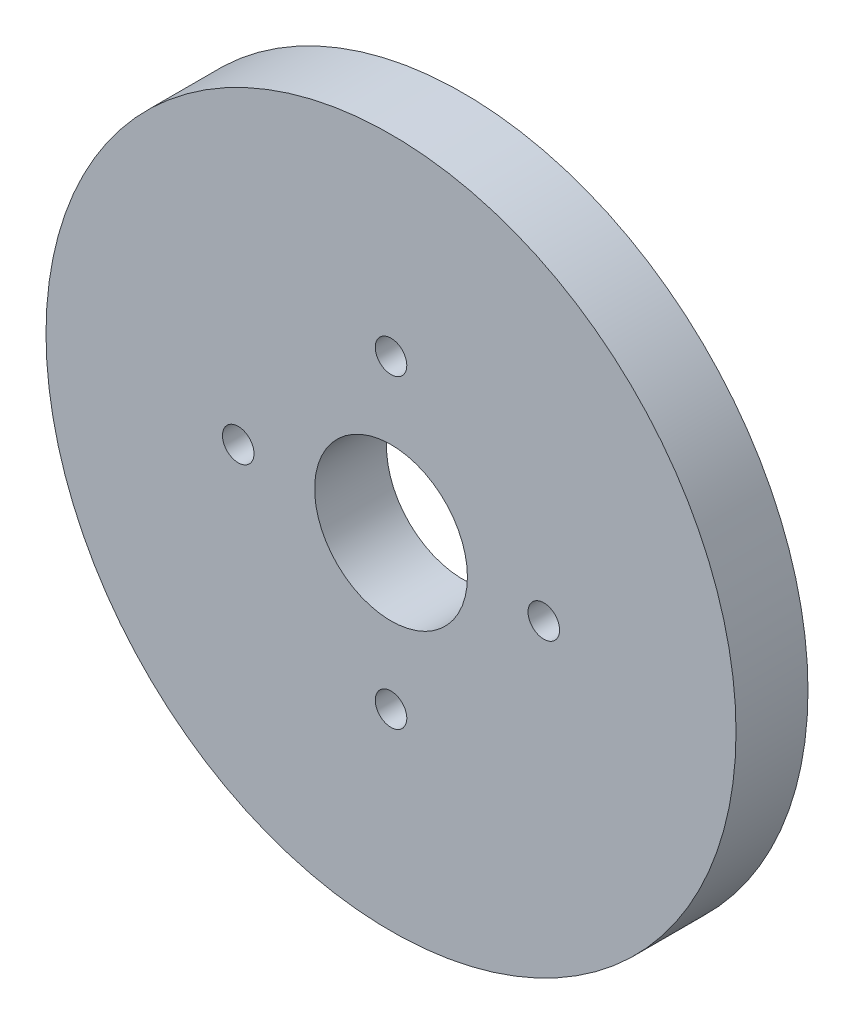
ISO-10303-21;
HEADER;
FILE_DESCRIPTION(('STEP AP214'),'2;1');
FILE_NAME('part.step','',(''),(''),'','','');
FILE_SCHEMA(('AUTOMOTIVE_DESIGN { 1 0 10303 214 1 1 1 1 }'));
ENDSEC;
DATA;
#1=APPLICATION_CONTEXT('core data for automotive mechanical design processes');
#2=APPLICATION_PROTOCOL_DEFINITION('international standard','automotive_design',2000,#1);
#3=PRODUCT_CONTEXT('',#1,'mechanical');
#4=PRODUCT('Part','Part','',(#3));
#5=PRODUCT_RELATED_PRODUCT_CATEGORY('part','',(#4));
#6=PRODUCT_DEFINITION_FORMATION('','',#4);
#7=PRODUCT_DEFINITION_CONTEXT('part definition',#1,'design');
#8=PRODUCT_DEFINITION('design','',#6,#7);
#9=PRODUCT_DEFINITION_SHAPE('','',#8);
#10=(LENGTH_UNIT() NAMED_UNIT(*) SI_UNIT(.MILLI.,.METRE.));
#11=(NAMED_UNIT(*) PLANE_ANGLE_UNIT() SI_UNIT($,.RADIAN.));
#12=(NAMED_UNIT(*) SI_UNIT($,.STERADIAN.) SOLID_ANGLE_UNIT());
#13=UNCERTAINTY_MEASURE_WITH_UNIT(LENGTH_MEASURE(1.E-05),#10,'distance_accuracy_value','');
#14=(GEOMETRIC_REPRESENTATION_CONTEXT(3) GLOBAL_UNCERTAINTY_ASSIGNED_CONTEXT((#13)) GLOBAL_UNIT_ASSIGNED_CONTEXT((#10,
#11,#12)) REPRESENTATION_CONTEXT('',''));
#15=CARTESIAN_POINT('',(0.,0.,0.));
#16=DIRECTION('',(0.,0.,1.));
#17=DIRECTION('',(1.,0.,0.));
#18=AXIS2_PLACEMENT_3D('',#15,#16,#17);
#19=CARTESIAN_POINT('',(0.,0.,1.825));
#20=DIRECTION('',(0.,0.,1.));
#21=DIRECTION('',(1.,0.,0.));
#22=AXIS2_PLACEMENT_3D('',#19,#20,#21);
#23=PLANE('',#22);
#24=CARTESIAN_POINT('',(-7.75,0.,1.825));
#25=DIRECTION('',(0.,0.,1.));
#26=DIRECTION('',(-1.,0.,0.));
#27=AXIS2_PLACEMENT_3D('',#24,#25,#26);
#28=CIRCLE('',#27,0.800000000000001);
#29=CARTESIAN_POINT('',(-8.55,0.,1.825));
#30=VERTEX_POINT('',#29);
#31=EDGE_CURVE('E56',#30,#30,#28,.T.);
#32=ORIENTED_EDGE('',*,*,#31,.F.);
#33=EDGE_LOOP('',(#32));
#34=FACE_BOUND('',#33,.T.);
#35=CARTESIAN_POINT('',(7.75,0.,1.825));
#36=DIRECTION('',(0.,0.,1.));
#37=DIRECTION('',(1.,0.,0.));
#38=AXIS2_PLACEMENT_3D('',#35,#36,#37);
#39=CIRCLE('',#38,0.800000000000001);
#40=CARTESIAN_POINT('',(8.55,0.,1.825));
#41=VERTEX_POINT('',#40);
#42=EDGE_CURVE('E44',#41,#41,#39,.T.);
#43=ORIENTED_EDGE('',*,*,#42,.F.);
#44=EDGE_LOOP('',(#43));
#45=FACE_BOUND('',#44,.T.);
#46=CARTESIAN_POINT('',(0.,0.,1.825));
#47=DIRECTION('',(0.,0.,1.));
#48=DIRECTION('',(1.,0.,0.));
#49=AXIS2_PLACEMENT_3D('',#46,#47,#48);
#50=CIRCLE('',#49,17.5);
#51=CARTESIAN_POINT('',(17.5,0.,1.825));
#52=VERTEX_POINT('',#51);
#53=EDGE_CURVE('E10',#52,#52,#50,.T.);
#54=ORIENTED_EDGE('',*,*,#53,.T.);
#55=EDGE_LOOP('',(#54));
#56=FACE_BOUND('',#55,.T.);
#57=CARTESIAN_POINT('',(0.,0.,1.825));
#58=DIRECTION('',(0.,0.,1.));
#59=DIRECTION('',(1.,0.,0.));
#60=AXIS2_PLACEMENT_3D('',#57,#58,#59);
#61=CIRCLE('',#60,3.875);
#62=CARTESIAN_POINT('',(3.875,0.,1.825));
#63=VERTEX_POINT('',#62);
#64=EDGE_CURVE('E39',#63,#63,#61,.T.);
#65=ORIENTED_EDGE('',*,*,#64,.F.);
#66=EDGE_LOOP('',(#65));
#67=FACE_BOUND('',#66,.T.);
#68=CARTESIAN_POINT('',(0.,7.75,1.825));
#69=DIRECTION('',(0.,0.,1.));
#70=DIRECTION('',(1.,0.,0.));
#71=AXIS2_PLACEMENT_3D('',#68,#69,#70);
#72=CIRCLE('',#71,0.8);
#73=CARTESIAN_POINT('',(0.8,7.75,1.825));
#74=VERTEX_POINT('',#73);
#75=EDGE_CURVE('E50',#74,#74,#72,.T.);
#76=ORIENTED_EDGE('',*,*,#75,.F.);
#77=EDGE_LOOP('',(#76));
#78=FACE_BOUND('',#77,.T.);
#79=CARTESIAN_POINT('',(0.,-7.75,1.825));
#80=DIRECTION('',(0.,0.,1.));
#81=DIRECTION('',(-1.,0.,0.));
#82=AXIS2_PLACEMENT_3D('',#79,#80,#81);
#83=CIRCLE('',#82,0.8);
#84=CARTESIAN_POINT('',(-0.799999999999998,-7.75,1.825));
#85=VERTEX_POINT('',#84);
#86=EDGE_CURVE('E62',#85,#85,#83,.T.);
#87=ORIENTED_EDGE('',*,*,#86,.F.);
#88=EDGE_LOOP('',(#87));
#89=FACE_BOUND('',#88,.T.);
#90=ADVANCED_FACE('F28',(#34,#45,#56,#67,#78,#89),#23,.T.);
#91=CARTESIAN_POINT('',(0.,0.,-1.825));
#92=DIRECTION('',(0.,0.,1.));
#93=DIRECTION('',(1.,0.,0.));
#94=AXIS2_PLACEMENT_3D('',#91,#92,#93);
#95=PLANE('',#94);
#96=CARTESIAN_POINT('',(0.,0.,-1.825));
#97=DIRECTION('',(0.,0.,1.));
#98=DIRECTION('',(1.,0.,0.));
#99=AXIS2_PLACEMENT_3D('',#96,#97,#98);
#100=CIRCLE('',#99,17.5);
#101=CARTESIAN_POINT('',(17.5,0.,-1.825));
#102=VERTEX_POINT('',#101);
#103=EDGE_CURVE('E32',#102,#102,#100,.T.);
#104=ORIENTED_EDGE('',*,*,#103,.F.);
#105=EDGE_LOOP('',(#104));
#106=FACE_BOUND('',#105,.T.);
#107=CARTESIAN_POINT('',(0.,0.,-1.825));
#108=DIRECTION('',(0.,0.,1.));
#109=DIRECTION('',(1.,0.,0.));
#110=AXIS2_PLACEMENT_3D('',#107,#108,#109);
#111=CIRCLE('',#110,3.875);
#112=CARTESIAN_POINT('',(3.875,0.,-1.825));
#113=VERTEX_POINT('',#112);
#114=EDGE_CURVE('E41',#113,#113,#111,.T.);
#115=ORIENTED_EDGE('',*,*,#114,.T.);
#116=EDGE_LOOP('',(#115));
#117=FACE_BOUND('',#116,.T.);
#118=CARTESIAN_POINT('',(7.75,0.,-1.825));
#119=DIRECTION('',(0.,0.,1.));
#120=DIRECTION('',(1.,0.,0.));
#121=AXIS2_PLACEMENT_3D('',#118,#119,#120);
#122=CIRCLE('',#121,0.800000000000001);
#123=CARTESIAN_POINT('',(8.55,0.,-1.825));
#124=VERTEX_POINT('',#123);
#125=EDGE_CURVE('E47',#124,#124,#122,.T.);
#126=ORIENTED_EDGE('',*,*,#125,.T.);
#127=EDGE_LOOP('',(#126));
#128=FACE_BOUND('',#127,.T.);
#129=CARTESIAN_POINT('',(0.,7.75,-1.825));
#130=DIRECTION('',(0.,0.,1.));
#131=DIRECTION('',(1.,0.,0.));
#132=AXIS2_PLACEMENT_3D('',#129,#130,#131);
#133=CIRCLE('',#132,0.8);
#134=CARTESIAN_POINT('',(0.8,7.75,-1.825));
#135=VERTEX_POINT('',#134);
#136=EDGE_CURVE('E53',#135,#135,#133,.T.);
#137=ORIENTED_EDGE('',*,*,#136,.T.);
#138=EDGE_LOOP('',(#137));
#139=FACE_BOUND('',#138,.T.);
#140=CARTESIAN_POINT('',(-7.75,0.,-1.825));
#141=DIRECTION('',(0.,0.,1.));
#142=DIRECTION('',(-1.,0.,0.));
#143=AXIS2_PLACEMENT_3D('',#140,#141,#142);
#144=CIRCLE('',#143,0.800000000000001);
#145=CARTESIAN_POINT('',(-8.55,0.,-1.825));
#146=VERTEX_POINT('',#145);
#147=EDGE_CURVE('E59',#146,#146,#144,.T.);
#148=ORIENTED_EDGE('',*,*,#147,.T.);
#149=EDGE_LOOP('',(#148));
#150=FACE_BOUND('',#149,.T.);
#151=CARTESIAN_POINT('',(0.,-7.75,-1.825));
#152=DIRECTION('',(0.,0.,1.));
#153=DIRECTION('',(-1.,0.,0.));
#154=AXIS2_PLACEMENT_3D('',#151,#152,#153);
#155=CIRCLE('',#154,0.8);
#156=CARTESIAN_POINT('',(-0.799999999999998,-7.75,-1.825));
#157=VERTEX_POINT('',#156);
#158=EDGE_CURVE('E65',#157,#157,#155,.T.);
#159=ORIENTED_EDGE('',*,*,#158,.T.);
#160=EDGE_LOOP('',(#159));
#161=FACE_BOUND('',#160,.T.);
#162=ADVANCED_FACE('F75',(#106,#117,#128,#139,#150,#161),#95,.F.);
#163=CARTESIAN_POINT('',(0.,0.,1.825));
#164=DIRECTION('',(0.,0.,-1.));
#165=DIRECTION('',(-1.,0.,0.));
#166=AXIS2_PLACEMENT_3D('',#163,#164,#165);
#167=CYLINDRICAL_SURFACE('',#166,17.5);
#168=ORIENTED_EDGE('',*,*,#53,.F.);
#169=EDGE_LOOP('',(#168));
#170=FACE_BOUND('',#169,.T.);
#171=ORIENTED_EDGE('',*,*,#103,.T.);
#172=EDGE_LOOP('',(#171));
#173=FACE_BOUND('',#172,.T.);
#174=ADVANCED_FACE('F30',(#170,#173),#167,.T.);
#175=CARTESIAN_POINT('',(0.,0.,1.825));
#176=DIRECTION('',(0.,0.,-1.));
#177=DIRECTION('',(-1.,0.,0.));
#178=AXIS2_PLACEMENT_3D('',#175,#176,#177);
#179=CYLINDRICAL_SURFACE('',#178,3.875);
#180=ORIENTED_EDGE('',*,*,#64,.T.);
#181=EDGE_LOOP('',(#180));
#182=FACE_BOUND('',#181,.T.);
#183=ORIENTED_EDGE('',*,*,#114,.F.);
#184=EDGE_LOOP('',(#183));
#185=FACE_BOUND('',#184,.T.);
#186=ADVANCED_FACE('F85',(#182,#185),#179,.F.);
#187=CARTESIAN_POINT('',(7.75,0.,1.825));
#188=DIRECTION('',(0.,0.,-1.));
#189=DIRECTION('',(-1.,0.,0.));
#190=AXIS2_PLACEMENT_3D('',#187,#188,#189);
#191=CYLINDRICAL_SURFACE('',#190,0.800000000000001);
#192=ORIENTED_EDGE('',*,*,#42,.T.);
#193=EDGE_LOOP('',(#192));
#194=FACE_BOUND('',#193,.T.);
#195=ORIENTED_EDGE('',*,*,#125,.F.);
#196=EDGE_LOOP('',(#195));
#197=FACE_BOUND('',#196,.T.);
#198=ADVANCED_FACE('F88',(#194,#197),#191,.F.);
#199=CARTESIAN_POINT('',(0.,7.75,1.825));
#200=DIRECTION('',(0.,0.,-1.));
#201=DIRECTION('',(-1.,0.,0.));
#202=AXIS2_PLACEMENT_3D('',#199,#200,#201);
#203=CYLINDRICAL_SURFACE('',#202,0.8);
#204=ORIENTED_EDGE('',*,*,#75,.T.);
#205=EDGE_LOOP('',(#204));
#206=FACE_BOUND('',#205,.T.);
#207=ORIENTED_EDGE('',*,*,#136,.F.);
#208=EDGE_LOOP('',(#207));
#209=FACE_BOUND('',#208,.T.);
#210=ADVANCED_FACE('F92',(#206,#209),#203,.F.);
#211=CARTESIAN_POINT('',(-7.75,0.,1.825));
#212=DIRECTION('',(0.,0.,-1.));
#213=DIRECTION('',(-1.,0.,0.));
#214=AXIS2_PLACEMENT_3D('',#211,#212,#213);
#215=CYLINDRICAL_SURFACE('',#214,0.800000000000001);
#216=ORIENTED_EDGE('',*,*,#31,.T.);
#217=EDGE_LOOP('',(#216));
#218=FACE_BOUND('',#217,.T.);
#219=ORIENTED_EDGE('',*,*,#147,.F.);
#220=EDGE_LOOP('',(#219));
#221=FACE_BOUND('',#220,.T.);
#222=ADVANCED_FACE('F96',(#218,#221),#215,.F.);
#223=CARTESIAN_POINT('',(0.,-7.75,1.825));
#224=DIRECTION('',(0.,0.,-1.));
#225=DIRECTION('',(-1.,0.,0.));
#226=AXIS2_PLACEMENT_3D('',#223,#224,#225);
#227=CYLINDRICAL_SURFACE('',#226,0.8);
#228=ORIENTED_EDGE('',*,*,#86,.T.);
#229=EDGE_LOOP('',(#228));
#230=FACE_BOUND('',#229,.T.);
#231=ORIENTED_EDGE('',*,*,#158,.F.);
#232=EDGE_LOOP('',(#231));
#233=FACE_BOUND('',#232,.T.);
#234=ADVANCED_FACE('F71',(#230,#233),#227,.F.);
#235=CLOSED_SHELL('',(#90,#162,#174,#186,#198,#210,#222,#234));
#236=MANIFOLD_SOLID_BREP('B2',#235);
#237=ADVANCED_BREP_SHAPE_REPRESENTATION('',(#18,#236),#14);
#238=SHAPE_DEFINITION_REPRESENTATION(#9,#237);
ENDSEC;
END-ISO-10303-21;
